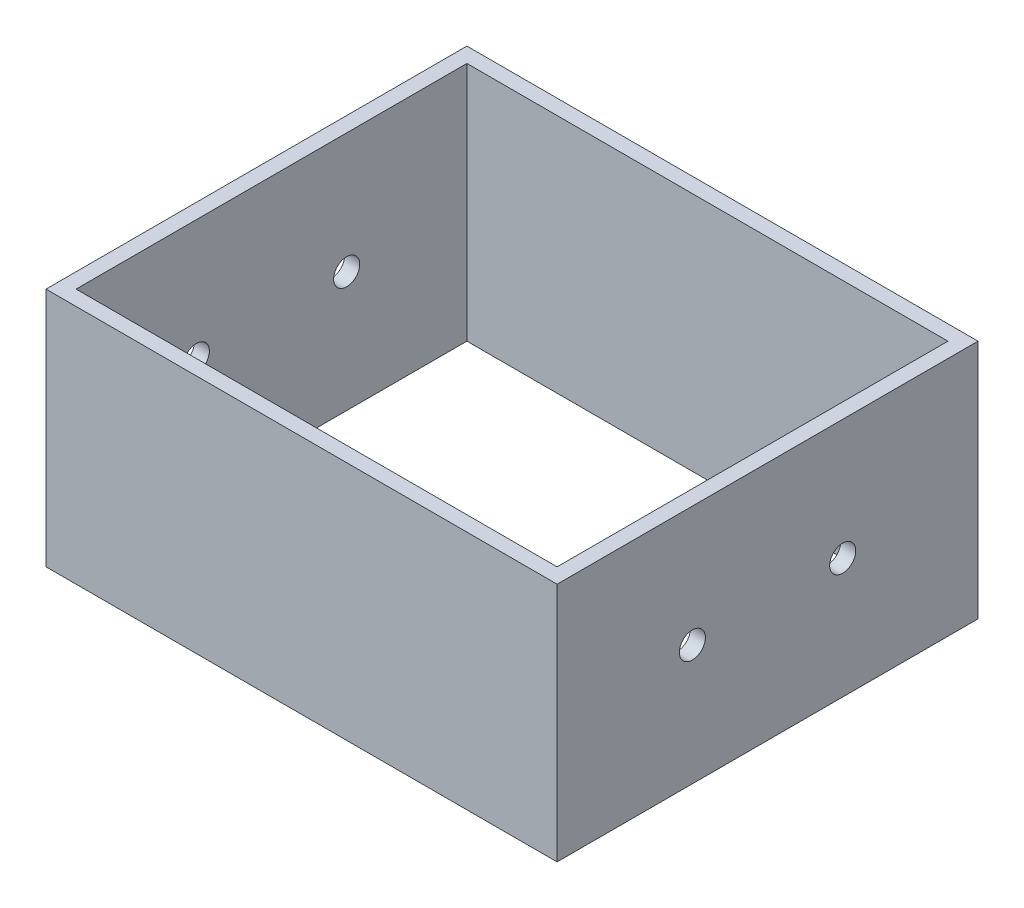
ISO-10303-21;
HEADER;
FILE_DESCRIPTION(('STEP AP214'),'2;1');
FILE_NAME('part.step','',(''),(''),'','','');
FILE_SCHEMA(('AUTOMOTIVE_DESIGN { 1 0 10303 214 1 1 1 1 }'));
ENDSEC;
DATA;
#1=APPLICATION_CONTEXT('core data for automotive mechanical design processes');
#2=APPLICATION_PROTOCOL_DEFINITION('international standard','automotive_design',2000,#1);
#3=PRODUCT_CONTEXT('',#1,'mechanical');
#4=PRODUCT('Part','Part','',(#3));
#5=PRODUCT_RELATED_PRODUCT_CATEGORY('part','',(#4));
#6=PRODUCT_DEFINITION_FORMATION('','',#4);
#7=PRODUCT_DEFINITION_CONTEXT('part definition',#1,'design');
#8=PRODUCT_DEFINITION('design','',#6,#7);
#9=PRODUCT_DEFINITION_SHAPE('','',#8);
#10=(LENGTH_UNIT() NAMED_UNIT(*) SI_UNIT(.MILLI.,.METRE.));
#11=(NAMED_UNIT(*) PLANE_ANGLE_UNIT() SI_UNIT($,.RADIAN.));
#12=(NAMED_UNIT(*) SI_UNIT($,.STERADIAN.) SOLID_ANGLE_UNIT());
#13=UNCERTAINTY_MEASURE_WITH_UNIT(LENGTH_MEASURE(1.E-05),#10,'distance_accuracy_value','');
#14=(GEOMETRIC_REPRESENTATION_CONTEXT(3) GLOBAL_UNCERTAINTY_ASSIGNED_CONTEXT((#13)) GLOBAL_UNIT_ASSIGNED_CONTEXT((#10,
#11,#12)) REPRESENTATION_CONTEXT('',''));
#15=CARTESIAN_POINT('',(0.,0.,0.));
#16=DIRECTION('',(0.,0.,1.));
#17=DIRECTION('',(1.,0.,0.));
#18=AXIS2_PLACEMENT_3D('',#15,#16,#17);
#19=CARTESIAN_POINT('',(0.,101.6,0.));
#20=DIRECTION('',(0.,-1.,0.));
#21=DIRECTION('',(0.,0.,-1.));
#22=AXIS2_PLACEMENT_3D('',#19,#20,#21);
#23=PLANE('',#22);
#24=DIRECTION('',(0.,0.,1.));
#25=VECTOR('',#24,1.);
#26=CARTESIAN_POINT('',(-6.35,101.6,6.35));
#27=LINE('',#26,#25);
#28=CARTESIAN_POINT('',(-6.35,101.6,-171.45));
#29=VERTEX_POINT('',#28);
#30=CARTESIAN_POINT('',(-6.35,101.6,6.35));
#31=VERTEX_POINT('',#30);
#32=EDGE_CURVE('E141',#29,#31,#27,.T.);
#33=ORIENTED_EDGE('',*,*,#32,.T.);
#34=DIRECTION('',(1.,0.,0.));
#35=VECTOR('',#34,1.);
#36=CARTESIAN_POINT('',(-6.35,101.6,6.35));
#37=LINE('',#36,#35);
#38=CARTESIAN_POINT('',(209.55,101.6,6.35));
#39=VERTEX_POINT('',#38);
#40=EDGE_CURVE('E144',#31,#39,#37,.T.);
#41=ORIENTED_EDGE('',*,*,#40,.T.);
#42=DIRECTION('',(0.,0.,-1.));
#43=VECTOR('',#42,1.);
#44=CARTESIAN_POINT('',(209.55,101.6,6.35));
#45=LINE('',#44,#43);
#46=CARTESIAN_POINT('',(209.55,101.6,-171.45));
#47=VERTEX_POINT('',#46);
#48=EDGE_CURVE('E147',#39,#47,#45,.T.);
#49=ORIENTED_EDGE('',*,*,#48,.T.);
#50=DIRECTION('',(-1.,0.,0.));
#51=VECTOR('',#50,1.);
#52=CARTESIAN_POINT('',(-6.35,101.6,-171.45));
#53=LINE('',#52,#51);
#54=EDGE_CURVE('E149',#47,#29,#53,.T.);
#55=ORIENTED_EDGE('',*,*,#54,.T.);
#56=EDGE_LOOP('',(#33,#41,#49,#55));
#57=FACE_BOUND('',#56,.T.);
#58=DIRECTION('',(0.,0.,1.));
#59=VECTOR('',#58,1.);
#60=CARTESIAN_POINT('',(0.,101.6,0.));
#61=LINE('',#60,#59);
#62=CARTESIAN_POINT('',(0.,101.6,-165.1));
#63=VERTEX_POINT('',#62);
#64=CARTESIAN_POINT('',(0.,101.6,0.));
#65=VERTEX_POINT('',#64);
#66=EDGE_CURVE('E103',#63,#65,#61,.T.);
#67=ORIENTED_EDGE('',*,*,#66,.F.);
#68=DIRECTION('',(-1.,0.,0.));
#69=VECTOR('',#68,1.);
#70=CARTESIAN_POINT('',(0.,101.6,-165.1));
#71=LINE('',#70,#69);
#72=CARTESIAN_POINT('',(203.2,101.6,-165.1));
#73=VERTEX_POINT('',#72);
#74=EDGE_CURVE('E125',#73,#63,#71,.T.);
#75=ORIENTED_EDGE('',*,*,#74,.F.);
#76=DIRECTION('',(0.,0.,-1.));
#77=VECTOR('',#76,1.);
#78=CARTESIAN_POINT('',(203.2,101.6,0.));
#79=LINE('',#78,#77);
#80=CARTESIAN_POINT('',(203.2,101.6,0.));
#81=VERTEX_POINT('',#80);
#82=EDGE_CURVE('E123',#81,#73,#79,.T.);
#83=ORIENTED_EDGE('',*,*,#82,.F.);
#84=DIRECTION('',(1.,0.,0.));
#85=VECTOR('',#84,1.);
#86=CARTESIAN_POINT('',(0.,101.6,0.));
#87=LINE('',#86,#85);
#88=EDGE_CURVE('E111',#65,#81,#87,.T.);
#89=ORIENTED_EDGE('',*,*,#88,.F.);
#90=EDGE_LOOP('',(#67,#75,#83,#89));
#91=FACE_BOUND('',#90,.T.);
#92=ADVANCED_FACE('F36',(#57,#91),#23,.F.);
#93=CARTESIAN_POINT('',(0.,0.,0.));
#94=DIRECTION('',(0.,-1.,0.));
#95=DIRECTION('',(0.,0.,-1.));
#96=AXIS2_PLACEMENT_3D('',#93,#94,#95);
#97=PLANE('',#96);
#98=DIRECTION('',(0.,0.,1.));
#99=VECTOR('',#98,1.);
#100=CARTESIAN_POINT('',(-6.35,0.,6.35));
#101=LINE('',#100,#99);
#102=CARTESIAN_POINT('',(-6.35,0.,-171.45));
#103=VERTEX_POINT('',#102);
#104=CARTESIAN_POINT('',(-6.35,0.,6.35));
#105=VERTEX_POINT('',#104);
#106=EDGE_CURVE('E119',#103,#105,#101,.T.);
#107=ORIENTED_EDGE('',*,*,#106,.F.);
#108=DIRECTION('',(-1.,0.,0.));
#109=VECTOR('',#108,1.);
#110=CARTESIAN_POINT('',(-6.35,0.,-171.45));
#111=LINE('',#110,#109);
#112=CARTESIAN_POINT('',(209.55,0.,-171.45));
#113=VERTEX_POINT('',#112);
#114=EDGE_CURVE('E145',#113,#103,#111,.T.);
#115=ORIENTED_EDGE('',*,*,#114,.F.);
#116=DIRECTION('',(0.,0.,-1.));
#117=VECTOR('',#116,1.);
#118=CARTESIAN_POINT('',(209.55,0.,6.35));
#119=LINE('',#118,#117);
#120=CARTESIAN_POINT('',(209.55,0.,6.35));
#121=VERTEX_POINT('',#120);
#122=EDGE_CURVE('E156',#121,#113,#119,.T.);
#123=ORIENTED_EDGE('',*,*,#122,.F.);
#124=DIRECTION('',(1.,0.,0.));
#125=VECTOR('',#124,1.);
#126=CARTESIAN_POINT('',(-6.35,0.,6.35));
#127=LINE('',#126,#125);
#128=EDGE_CURVE('E154',#105,#121,#127,.T.);
#129=ORIENTED_EDGE('',*,*,#128,.F.);
#130=EDGE_LOOP('',(#107,#115,#123,#129));
#131=FACE_BOUND('',#130,.T.);
#132=DIRECTION('',(-1.,0.,0.));
#133=VECTOR('',#132,1.);
#134=CARTESIAN_POINT('',(0.,0.,-165.1));
#135=LINE('',#134,#133);
#136=CARTESIAN_POINT('',(203.2,0.,-165.1));
#137=VERTEX_POINT('',#136);
#138=CARTESIAN_POINT('',(0.,0.,-165.1));
#139=VERTEX_POINT('',#138);
#140=EDGE_CURVE('E112',#137,#139,#135,.T.);
#141=ORIENTED_EDGE('',*,*,#140,.T.);
#142=DIRECTION('',(0.,0.,1.));
#143=VECTOR('',#142,1.);
#144=CARTESIAN_POINT('',(0.,0.,0.));
#145=LINE('',#144,#143);
#146=CARTESIAN_POINT('',(0.,0.,0.));
#147=VERTEX_POINT('',#146);
#148=EDGE_CURVE('E61',#139,#147,#145,.T.);
#149=ORIENTED_EDGE('',*,*,#148,.T.);
#150=DIRECTION('',(1.,0.,0.));
#151=VECTOR('',#150,1.);
#152=CARTESIAN_POINT('',(0.,0.,0.));
#153=LINE('',#152,#151);
#154=CARTESIAN_POINT('',(203.2,0.,0.));
#155=VERTEX_POINT('',#154);
#156=EDGE_CURVE('E118',#147,#155,#153,.T.);
#157=ORIENTED_EDGE('',*,*,#156,.T.);
#158=DIRECTION('',(0.,0.,-1.));
#159=VECTOR('',#158,1.);
#160=CARTESIAN_POINT('',(203.2,0.,0.));
#161=LINE('',#160,#159);
#162=EDGE_CURVE('E133',#155,#137,#161,.T.);
#163=ORIENTED_EDGE('',*,*,#162,.T.);
#164=EDGE_LOOP('',(#141,#149,#157,#163));
#165=FACE_BOUND('',#164,.T.);
#166=ADVANCED_FACE('F203',(#131,#165),#97,.T.);
#167=CARTESIAN_POINT('',(-6.35,101.6,6.35));
#168=DIRECTION('',(1.,0.,0.));
#169=DIRECTION('',(0.,0.,-1.));
#170=AXIS2_PLACEMENT_3D('',#167,#168,#169);
#171=PLANE('',#170);
#172=CARTESIAN_POINT('',(-6.34999999999999,50.8,-50.8));
#173=DIRECTION('',(1.,0.,0.));
#174=DIRECTION('',(0.,0.,-1.));
#175=AXIS2_PLACEMENT_3D('',#172,#173,#174);
#176=CIRCLE('',#175,5.49926131403119);
#177=CARTESIAN_POINT('',(-6.34999999999999,50.8,-56.2992613140312));
#178=VERTEX_POINT('',#177);
#179=EDGE_CURVE('E168',#178,#178,#176,.T.);
#180=ORIENTED_EDGE('',*,*,#179,.T.);
#181=EDGE_LOOP('',(#180));
#182=FACE_BOUND('',#181,.T.);
#183=CARTESIAN_POINT('',(-6.34999999999999,50.8,-114.3));
#184=DIRECTION('',(1.,0.,0.));
#185=DIRECTION('',(0.,0.,-1.));
#186=AXIS2_PLACEMENT_3D('',#183,#184,#185);
#187=CIRCLE('',#186,5.49926131403119);
#188=CARTESIAN_POINT('',(-6.34999999999999,50.8,-119.799261314031));
#189=VERTEX_POINT('',#188);
#190=EDGE_CURVE('E179',#189,#189,#187,.T.);
#191=ORIENTED_EDGE('',*,*,#190,.T.);
#192=EDGE_LOOP('',(#191));
#193=FACE_BOUND('',#192,.T.);
#194=ORIENTED_EDGE('',*,*,#106,.T.);
#195=DIRECTION('',(0.,-1.,0.));
#196=VECTOR('',#195,1.);
#197=CARTESIAN_POINT('',(-6.35,101.6,6.35));
#198=LINE('',#197,#196);
#199=EDGE_CURVE('E11',#31,#105,#198,.T.);
#200=ORIENTED_EDGE('',*,*,#199,.F.);
#201=ORIENTED_EDGE('',*,*,#32,.F.);
#202=DIRECTION('',(0.,-1.,0.));
#203=VECTOR('',#202,1.);
#204=CARTESIAN_POINT('',(-6.35,101.6,-171.45));
#205=LINE('',#204,#203);
#206=EDGE_CURVE('E151',#29,#103,#205,.T.);
#207=ORIENTED_EDGE('',*,*,#206,.T.);
#208=EDGE_LOOP('',(#194,#200,#201,#207));
#209=FACE_BOUND('',#208,.T.);
#210=ADVANCED_FACE('F38',(#182,#193,#209),#171,.F.);
#211=CARTESIAN_POINT('',(-6.35,101.6,6.35));
#212=DIRECTION('',(0.,0.,-1.));
#213=DIRECTION('',(-1.,0.,0.));
#214=AXIS2_PLACEMENT_3D('',#211,#212,#213);
#215=PLANE('',#214);
#216=ORIENTED_EDGE('',*,*,#128,.T.);
#217=DIRECTION('',(0.,-1.,0.));
#218=VECTOR('',#217,1.);
#219=CARTESIAN_POINT('',(209.55,101.6,6.35));
#220=LINE('',#219,#218);
#221=EDGE_CURVE('E45',#39,#121,#220,.T.);
#222=ORIENTED_EDGE('',*,*,#221,.F.);
#223=ORIENTED_EDGE('',*,*,#40,.F.);
#224=ORIENTED_EDGE('',*,*,#199,.T.);
#225=EDGE_LOOP('',(#216,#222,#223,#224));
#226=FACE_BOUND('',#225,.T.);
#227=ADVANCED_FACE('F229',(#226),#215,.F.);
#228=CARTESIAN_POINT('',(209.55,101.6,6.35));
#229=DIRECTION('',(-1.,0.,0.));
#230=DIRECTION('',(0.,0.,1.));
#231=AXIS2_PLACEMENT_3D('',#228,#229,#230);
#232=PLANE('',#231);
#233=CARTESIAN_POINT('',(209.55,50.8,-50.8));
#234=DIRECTION('',(1.,0.,0.));
#235=DIRECTION('',(0.,0.,-1.));
#236=AXIS2_PLACEMENT_3D('',#233,#234,#235);
#237=CIRCLE('',#236,5.49926131403119);
#238=CARTESIAN_POINT('',(209.55,50.8,-56.2992613140312));
#239=VERTEX_POINT('',#238);
#240=EDGE_CURVE('E174',#239,#239,#237,.T.);
#241=ORIENTED_EDGE('',*,*,#240,.F.);
#242=EDGE_LOOP('',(#241));
#243=FACE_BOUND('',#242,.T.);
#244=CARTESIAN_POINT('',(209.55,50.8,-114.3));
#245=DIRECTION('',(1.,0.,0.));
#246=DIRECTION('',(0.,0.,-1.));
#247=AXIS2_PLACEMENT_3D('',#244,#245,#246);
#248=CIRCLE('',#247,5.49926131403119);
#249=CARTESIAN_POINT('',(209.55,50.8,-119.799261314031));
#250=VERTEX_POINT('',#249);
#251=EDGE_CURVE('E184',#250,#250,#248,.T.);
#252=ORIENTED_EDGE('',*,*,#251,.F.);
#253=EDGE_LOOP('',(#252));
#254=FACE_BOUND('',#253,.T.);
#255=ORIENTED_EDGE('',*,*,#122,.T.);
#256=DIRECTION('',(0.,-1.,0.));
#257=VECTOR('',#256,1.);
#258=CARTESIAN_POINT('',(209.55,101.6,-171.45));
#259=LINE('',#258,#257);
#260=EDGE_CURVE('E161',#47,#113,#259,.T.);
#261=ORIENTED_EDGE('',*,*,#260,.F.);
#262=ORIENTED_EDGE('',*,*,#48,.F.);
#263=ORIENTED_EDGE('',*,*,#221,.T.);
#264=EDGE_LOOP('',(#255,#261,#262,#263));
#265=FACE_BOUND('',#264,.T.);
#266=ADVANCED_FACE('F226',(#243,#254,#265),#232,.F.);
#267=CARTESIAN_POINT('',(-6.35,101.6,-171.45));
#268=DIRECTION('',(0.,0.,1.));
#269=DIRECTION('',(1.,0.,0.));
#270=AXIS2_PLACEMENT_3D('',#267,#268,#269);
#271=PLANE('',#270);
#272=ORIENTED_EDGE('',*,*,#114,.T.);
#273=ORIENTED_EDGE('',*,*,#206,.F.);
#274=ORIENTED_EDGE('',*,*,#54,.F.);
#275=ORIENTED_EDGE('',*,*,#260,.T.);
#276=EDGE_LOOP('',(#272,#273,#274,#275));
#277=FACE_BOUND('',#276,.T.);
#278=ADVANCED_FACE('F223',(#277),#271,.F.);
#279=CARTESIAN_POINT('',(0.,101.6,0.));
#280=DIRECTION('',(1.,0.,0.));
#281=DIRECTION('',(0.,0.,-1.));
#282=AXIS2_PLACEMENT_3D('',#279,#280,#281);
#283=PLANE('',#282);
#284=CARTESIAN_POINT('',(0.,50.8,-50.8));
#285=DIRECTION('',(1.,0.,0.));
#286=DIRECTION('',(0.,0.,-1.));
#287=AXIS2_PLACEMENT_3D('',#284,#285,#286);
#288=CIRCLE('',#287,5.49926131403119);
#289=CARTESIAN_POINT('',(0.,50.8,-56.2992613140312));
#290=VERTEX_POINT('',#289);
#291=EDGE_CURVE('E131',#290,#290,#288,.T.);
#292=ORIENTED_EDGE('',*,*,#291,.F.);
#293=EDGE_LOOP('',(#292));
#294=FACE_BOUND('',#293,.T.);
#295=CARTESIAN_POINT('',(0.,50.8,-114.3));
#296=DIRECTION('',(1.,0.,0.));
#297=DIRECTION('',(0.,0.,-1.));
#298=AXIS2_PLACEMENT_3D('',#295,#296,#297);
#299=CIRCLE('',#298,5.49926131403119);
#300=CARTESIAN_POINT('',(0.,50.8,-119.799261314031));
#301=VERTEX_POINT('',#300);
#302=EDGE_CURVE('E167',#301,#301,#299,.T.);
#303=ORIENTED_EDGE('',*,*,#302,.F.);
#304=EDGE_LOOP('',(#303));
#305=FACE_BOUND('',#304,.T.);
#306=ORIENTED_EDGE('',*,*,#148,.F.);
#307=DIRECTION('',(0.,-1.,0.));
#308=VECTOR('',#307,1.);
#309=CARTESIAN_POINT('',(0.,101.6,-165.1));
#310=LINE('',#309,#308);
#311=EDGE_CURVE('E107',#63,#139,#310,.T.);
#312=ORIENTED_EDGE('',*,*,#311,.F.);
#313=ORIENTED_EDGE('',*,*,#66,.T.);
#314=DIRECTION('',(0.,-1.,0.));
#315=VECTOR('',#314,1.);
#316=CARTESIAN_POINT('',(0.,101.6,0.));
#317=LINE('',#316,#315);
#318=EDGE_CURVE('E106',#65,#147,#317,.T.);
#319=ORIENTED_EDGE('',*,*,#318,.T.);
#320=EDGE_LOOP('',(#306,#312,#313,#319));
#321=FACE_BOUND('',#320,.T.);
#322=ADVANCED_FACE('F105',(#294,#305,#321),#283,.T.);
#323=CARTESIAN_POINT('',(0.,101.6,0.));
#324=DIRECTION('',(0.,0.,-1.));
#325=DIRECTION('',(-1.,0.,0.));
#326=AXIS2_PLACEMENT_3D('',#323,#324,#325);
#327=PLANE('',#326);
#328=ORIENTED_EDGE('',*,*,#156,.F.);
#329=ORIENTED_EDGE('',*,*,#318,.F.);
#330=ORIENTED_EDGE('',*,*,#88,.T.);
#331=DIRECTION('',(0.,-1.,0.));
#332=VECTOR('',#331,1.);
#333=CARTESIAN_POINT('',(203.2,101.6,0.));
#334=LINE('',#333,#332);
#335=EDGE_CURVE('E120',#81,#155,#334,.T.);
#336=ORIENTED_EDGE('',*,*,#335,.T.);
#337=EDGE_LOOP('',(#328,#329,#330,#336));
#338=FACE_BOUND('',#337,.T.);
#339=ADVANCED_FACE('F115',(#338),#327,.T.);
#340=CARTESIAN_POINT('',(203.2,101.6,0.));
#341=DIRECTION('',(-1.,0.,0.));
#342=DIRECTION('',(0.,0.,1.));
#343=AXIS2_PLACEMENT_3D('',#340,#341,#342);
#344=PLANE('',#343);
#345=CARTESIAN_POINT('',(203.2,50.8,-50.8));
#346=DIRECTION('',(-1.,0.,0.));
#347=DIRECTION('',(0.,0.,1.));
#348=AXIS2_PLACEMENT_3D('',#345,#346,#347);
#349=CIRCLE('',#348,5.49926131403119);
#350=CARTESIAN_POINT('',(203.2,50.8,-45.3007386859688));
#351=VERTEX_POINT('',#350);
#352=EDGE_CURVE('E40',#351,#351,#349,.T.);
#353=ORIENTED_EDGE('',*,*,#352,.F.);
#354=EDGE_LOOP('',(#353));
#355=FACE_BOUND('',#354,.T.);
#356=CARTESIAN_POINT('',(203.2,50.8,-114.3));
#357=DIRECTION('',(-1.,0.,0.));
#358=DIRECTION('',(0.,0.,1.));
#359=AXIS2_PLACEMENT_3D('',#356,#357,#358);
#360=CIRCLE('',#359,5.49926131403119);
#361=CARTESIAN_POINT('',(203.2,50.8,-108.800738685969));
#362=VERTEX_POINT('',#361);
#363=EDGE_CURVE('E165',#362,#362,#360,.T.);
#364=ORIENTED_EDGE('',*,*,#363,.F.);
#365=EDGE_LOOP('',(#364));
#366=FACE_BOUND('',#365,.T.);
#367=ORIENTED_EDGE('',*,*,#162,.F.);
#368=ORIENTED_EDGE('',*,*,#335,.F.);
#369=ORIENTED_EDGE('',*,*,#82,.T.);
#370=DIRECTION('',(0.,-1.,0.));
#371=VECTOR('',#370,1.);
#372=CARTESIAN_POINT('',(203.2,101.6,-165.1));
#373=LINE('',#372,#371);
#374=EDGE_CURVE('E53',#73,#137,#373,.T.);
#375=ORIENTED_EDGE('',*,*,#374,.T.);
#376=EDGE_LOOP('',(#367,#368,#369,#375));
#377=FACE_BOUND('',#376,.T.);
#378=ADVANCED_FACE('F195',(#355,#366,#377),#344,.T.);
#379=CARTESIAN_POINT('',(0.,101.6,-165.1));
#380=DIRECTION('',(0.,0.,1.));
#381=DIRECTION('',(1.,0.,0.));
#382=AXIS2_PLACEMENT_3D('',#379,#380,#381);
#383=PLANE('',#382);
#384=ORIENTED_EDGE('',*,*,#140,.F.);
#385=ORIENTED_EDGE('',*,*,#374,.F.);
#386=ORIENTED_EDGE('',*,*,#74,.T.);
#387=ORIENTED_EDGE('',*,*,#311,.T.);
#388=EDGE_LOOP('',(#384,#385,#386,#387));
#389=FACE_BOUND('',#388,.T.);
#390=ADVANCED_FACE('F198',(#389),#383,.T.);
#391=CARTESIAN_POINT('',(-6.34999999999999,50.8,-114.3));
#392=DIRECTION('',(1.,0.,0.));
#393=DIRECTION('',(0.,0.,-1.));
#394=AXIS2_PLACEMENT_3D('',#391,#392,#393);
#395=CYLINDRICAL_SURFACE('',#394,5.49926131403119);
#396=ORIENTED_EDGE('',*,*,#363,.T.);
#397=EDGE_LOOP('',(#396));
#398=FACE_BOUND('',#397,.T.);
#399=ORIENTED_EDGE('',*,*,#251,.T.);
#400=EDGE_LOOP('',(#399));
#401=FACE_BOUND('',#400,.T.);
#402=ADVANCED_FACE('F205',(#398,#401),#395,.F.);
#403=CARTESIAN_POINT('',(-6.34999999999999,50.8,-50.8));
#404=DIRECTION('',(1.,0.,0.));
#405=DIRECTION('',(0.,0.,-1.));
#406=AXIS2_PLACEMENT_3D('',#403,#404,#405);
#407=CYLINDRICAL_SURFACE('',#406,5.49926131403119);
#408=ORIENTED_EDGE('',*,*,#352,.T.);
#409=EDGE_LOOP('',(#408));
#410=FACE_BOUND('',#409,.T.);
#411=ORIENTED_EDGE('',*,*,#240,.T.);
#412=EDGE_LOOP('',(#411));
#413=FACE_BOUND('',#412,.T.);
#414=ADVANCED_FACE('F192',(#410,#413),#407,.F.);
#415=ORIENTED_EDGE('',*,*,#302,.T.);
#416=EDGE_LOOP('',(#415));
#417=FACE_BOUND('',#416,.T.);
#418=ORIENTED_EDGE('',*,*,#190,.F.);
#419=EDGE_LOOP('',(#418));
#420=FACE_BOUND('',#419,.T.);
#421=ADVANCED_FACE('F211',(#417,#420),#395,.F.);
#422=ORIENTED_EDGE('',*,*,#291,.T.);
#423=EDGE_LOOP('',(#422));
#424=FACE_BOUND('',#423,.T.);
#425=ORIENTED_EDGE('',*,*,#179,.F.);
#426=EDGE_LOOP('',(#425));
#427=FACE_BOUND('',#426,.T.);
#428=ADVANCED_FACE('F254',(#424,#427),#407,.F.);
#429=CLOSED_SHELL('',(#92,#166,#210,#227,#266,#278,#322,#339,#378,#390,#402,#414,#421,#428));
#430=MANIFOLD_SOLID_BREP('B2',#429);
#431=ADVANCED_BREP_SHAPE_REPRESENTATION('',(#18,#430),#14);
#432=SHAPE_DEFINITION_REPRESENTATION(#9,#431);
ENDSEC;
END-ISO-10303-21;
